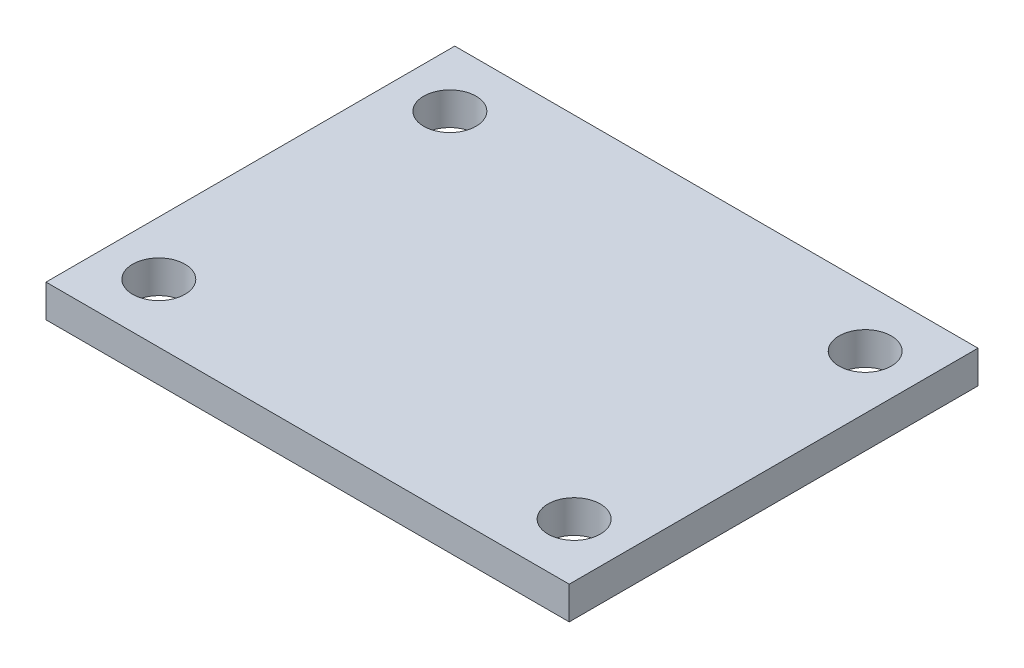
ISO-10303-21;
HEADER;
FILE_DESCRIPTION(('STEP AP214'),'2;1');
FILE_NAME('part.step','',(''),(''),'','','');
FILE_SCHEMA(('AUTOMOTIVE_DESIGN { 1 0 10303 214 1 1 1 1 }'));
ENDSEC;
DATA;
#1=APPLICATION_CONTEXT('core data for automotive mechanical design processes');
#2=APPLICATION_PROTOCOL_DEFINITION('international standard','automotive_design',2000,#1);
#3=PRODUCT_CONTEXT('',#1,'mechanical');
#4=PRODUCT('Part','Part','',(#3));
#5=PRODUCT_RELATED_PRODUCT_CATEGORY('part','',(#4));
#6=PRODUCT_DEFINITION_FORMATION('','',#4);
#7=PRODUCT_DEFINITION_CONTEXT('part definition',#1,'design');
#8=PRODUCT_DEFINITION('design','',#6,#7);
#9=PRODUCT_DEFINITION_SHAPE('','',#8);
#10=(LENGTH_UNIT() NAMED_UNIT(*) SI_UNIT(.MILLI.,.METRE.));
#11=(NAMED_UNIT(*) PLANE_ANGLE_UNIT() SI_UNIT($,.RADIAN.));
#12=(NAMED_UNIT(*) SI_UNIT($,.STERADIAN.) SOLID_ANGLE_UNIT());
#13=UNCERTAINTY_MEASURE_WITH_UNIT(LENGTH_MEASURE(1.E-05),#10,'distance_accuracy_value','');
#14=(GEOMETRIC_REPRESENTATION_CONTEXT(3) GLOBAL_UNCERTAINTY_ASSIGNED_CONTEXT((#13)) GLOBAL_UNIT_ASSIGNED_CONTEXT((#10,
#11,#12)) REPRESENTATION_CONTEXT('',''));
#15=CARTESIAN_POINT('',(0.,0.,0.));
#16=DIRECTION('',(0.,0.,1.));
#17=DIRECTION('',(1.,0.,0.));
#18=AXIS2_PLACEMENT_3D('',#15,#16,#17);
#19=CARTESIAN_POINT('',(-16.,2.,-12.5));
#20=DIRECTION('',(1.,0.,0.));
#21=DIRECTION('',(0.,0.,-1.));
#22=AXIS2_PLACEMENT_3D('',#19,#20,#21);
#23=PLANE('',#22);
#24=DIRECTION('',(0.,0.,1.));
#25=VECTOR('',#24,1.);
#26=CARTESIAN_POINT('',(-16.,0.,-12.5));
#27=LINE('',#26,#25);
#28=CARTESIAN_POINT('',(-16.,0.,-12.5));
#29=VERTEX_POINT('',#28);
#30=CARTESIAN_POINT('',(-16.,0.,12.5));
#31=VERTEX_POINT('',#30);
#32=EDGE_CURVE('E100',#29,#31,#27,.T.);
#33=ORIENTED_EDGE('',*,*,#32,.T.);
#34=DIRECTION('',(0.,-1.,0.));
#35=VECTOR('',#34,1.);
#36=CARTESIAN_POINT('',(-16.,2.,12.5));
#37=LINE('',#36,#35);
#38=CARTESIAN_POINT('',(-16.,2.,12.5));
#39=VERTEX_POINT('',#38);
#40=EDGE_CURVE('E11',#39,#31,#37,.T.);
#41=ORIENTED_EDGE('',*,*,#40,.F.);
#42=DIRECTION('',(0.,0.,1.));
#43=VECTOR('',#42,1.);
#44=CARTESIAN_POINT('',(-16.,2.,-12.5));
#45=LINE('',#44,#43);
#46=CARTESIAN_POINT('',(-16.,2.,-12.5));
#47=VERTEX_POINT('',#46);
#48=EDGE_CURVE('E86',#47,#39,#45,.T.);
#49=ORIENTED_EDGE('',*,*,#48,.F.);
#50=DIRECTION('',(0.,-1.,0.));
#51=VECTOR('',#50,1.);
#52=CARTESIAN_POINT('',(-16.,2.,-12.5));
#53=LINE('',#52,#51);
#54=EDGE_CURVE('E53',#47,#29,#53,.T.);
#55=ORIENTED_EDGE('',*,*,#54,.T.);
#56=EDGE_LOOP('',(#33,#41,#49,#55));
#57=FACE_BOUND('',#56,.T.);
#58=ADVANCED_FACE('F37',(#57),#23,.F.);
#59=CARTESIAN_POINT('',(-16.,2.,12.5));
#60=DIRECTION('',(0.,0.,-1.));
#61=DIRECTION('',(-1.,0.,0.));
#62=AXIS2_PLACEMENT_3D('',#59,#60,#61);
#63=PLANE('',#62);
#64=DIRECTION('',(1.,0.,0.));
#65=VECTOR('',#64,1.);
#66=CARTESIAN_POINT('',(-16.,0.,12.5));
#67=LINE('',#66,#65);
#68=CARTESIAN_POINT('',(16.,0.,12.5));
#69=VERTEX_POINT('',#68);
#70=EDGE_CURVE('E91',#31,#69,#67,.T.);
#71=ORIENTED_EDGE('',*,*,#70,.T.);
#72=DIRECTION('',(0.,-1.,0.));
#73=VECTOR('',#72,1.);
#74=CARTESIAN_POINT('',(16.,2.,12.5));
#75=LINE('',#74,#73);
#76=CARTESIAN_POINT('',(16.,2.,12.5));
#77=VERTEX_POINT('',#76);
#78=EDGE_CURVE('E45',#77,#69,#75,.T.);
#79=ORIENTED_EDGE('',*,*,#78,.F.);
#80=DIRECTION('',(1.,0.,0.));
#81=VECTOR('',#80,1.);
#82=CARTESIAN_POINT('',(-16.,2.,12.5));
#83=LINE('',#82,#81);
#84=EDGE_CURVE('E78',#39,#77,#83,.T.);
#85=ORIENTED_EDGE('',*,*,#84,.F.);
#86=ORIENTED_EDGE('',*,*,#40,.T.);
#87=EDGE_LOOP('',(#71,#79,#85,#86));
#88=FACE_BOUND('',#87,.T.);
#89=ADVANCED_FACE('F90',(#88),#63,.F.);
#90=CARTESIAN_POINT('',(16.,2.,-12.5));
#91=DIRECTION('',(1.,0.,0.));
#92=DIRECTION('',(0.,0.,-1.));
#93=AXIS2_PLACEMENT_3D('',#90,#91,#92);
#94=PLANE('',#93);
#95=DIRECTION('',(0.,0.,1.));
#96=VECTOR('',#95,1.);
#97=CARTESIAN_POINT('',(16.,0.,-12.5));
#98=LINE('',#97,#96);
#99=CARTESIAN_POINT('',(16.,0.,-12.5));
#100=VERTEX_POINT('',#99);
#101=EDGE_CURVE('E104',#100,#69,#98,.T.);
#102=ORIENTED_EDGE('',*,*,#101,.F.);
#103=DIRECTION('',(0.,-1.,0.));
#104=VECTOR('',#103,1.);
#105=CARTESIAN_POINT('',(16.,2.,-12.5));
#106=LINE('',#105,#104);
#107=CARTESIAN_POINT('',(16.,2.,-12.5));
#108=VERTEX_POINT('',#107);
#109=EDGE_CURVE('E67',#108,#100,#106,.T.);
#110=ORIENTED_EDGE('',*,*,#109,.F.);
#111=DIRECTION('',(0.,0.,1.));
#112=VECTOR('',#111,1.);
#113=CARTESIAN_POINT('',(16.,2.,-12.5));
#114=LINE('',#113,#112);
#115=EDGE_CURVE('E85',#108,#77,#114,.T.);
#116=ORIENTED_EDGE('',*,*,#115,.T.);
#117=ORIENTED_EDGE('',*,*,#78,.T.);
#118=EDGE_LOOP('',(#102,#110,#116,#117));
#119=FACE_BOUND('',#118,.T.);
#120=ADVANCED_FACE('F94',(#119),#94,.T.);
#121=CARTESIAN_POINT('',(-16.,2.,-12.5));
#122=DIRECTION('',(0.,0.,-1.));
#123=DIRECTION('',(-1.,0.,0.));
#124=AXIS2_PLACEMENT_3D('',#121,#122,#123);
#125=PLANE('',#124);
#126=DIRECTION('',(1.,0.,0.));
#127=VECTOR('',#126,1.);
#128=CARTESIAN_POINT('',(-16.,0.,-12.5));
#129=LINE('',#128,#127);
#130=EDGE_CURVE('E106',#29,#100,#129,.T.);
#131=ORIENTED_EDGE('',*,*,#130,.F.);
#132=ORIENTED_EDGE('',*,*,#54,.F.);
#133=DIRECTION('',(1.,0.,0.));
#134=VECTOR('',#133,1.);
#135=CARTESIAN_POINT('',(-16.,2.,-12.5));
#136=LINE('',#135,#134);
#137=EDGE_CURVE('E95',#47,#108,#136,.T.);
#138=ORIENTED_EDGE('',*,*,#137,.T.);
#139=ORIENTED_EDGE('',*,*,#109,.T.);
#140=EDGE_LOOP('',(#131,#132,#138,#139));
#141=FACE_BOUND('',#140,.T.);
#142=ADVANCED_FACE('F142',(#141),#125,.T.);
#143=CARTESIAN_POINT('',(0.,2.,0.));
#144=DIRECTION('',(0.,1.,0.));
#145=DIRECTION('',(0.,0.,1.));
#146=AXIS2_PLACEMENT_3D('',#143,#144,#145);
#147=PLANE('',#146);
#148=CARTESIAN_POINT('',(-12.7,2.,8.9));
#149=DIRECTION('',(0.,1.,0.));
#150=DIRECTION('',(0.,0.,1.));
#151=AXIS2_PLACEMENT_3D('',#148,#149,#150);
#152=CIRCLE('',#151,1.6);
#153=CARTESIAN_POINT('',(-12.7,2.,10.5));
#154=VERTEX_POINT('',#153);
#155=EDGE_CURVE('E115',#154,#154,#152,.T.);
#156=ORIENTED_EDGE('',*,*,#155,.F.);
#157=EDGE_LOOP('',(#156));
#158=FACE_BOUND('',#157,.T.);
#159=CARTESIAN_POINT('',(12.7,2.,-8.9));
#160=DIRECTION('',(0.,1.,0.));
#161=DIRECTION('',(0.,0.,1.));
#162=AXIS2_PLACEMENT_3D('',#159,#160,#161);
#163=CIRCLE('',#162,1.6);
#164=CARTESIAN_POINT('',(12.7,2.,-7.29999999999999));
#165=VERTEX_POINT('',#164);
#166=EDGE_CURVE('E121',#165,#165,#163,.T.);
#167=ORIENTED_EDGE('',*,*,#166,.F.);
#168=EDGE_LOOP('',(#167));
#169=FACE_BOUND('',#168,.T.);
#170=CARTESIAN_POINT('',(12.7,2.,8.9));
#171=DIRECTION('',(0.,1.,0.));
#172=DIRECTION('',(0.,0.,1.));
#173=AXIS2_PLACEMENT_3D('',#170,#171,#172);
#174=CIRCLE('',#173,1.6);
#175=CARTESIAN_POINT('',(12.7,2.,10.5));
#176=VERTEX_POINT('',#175);
#177=EDGE_CURVE('E122',#176,#176,#174,.T.);
#178=ORIENTED_EDGE('',*,*,#177,.F.);
#179=EDGE_LOOP('',(#178));
#180=FACE_BOUND('',#179,.T.);
#181=CARTESIAN_POINT('',(-12.7,2.,-8.9));
#182=DIRECTION('',(0.,1.,0.));
#183=DIRECTION('',(0.,0.,1.));
#184=AXIS2_PLACEMENT_3D('',#181,#182,#183);
#185=CIRCLE('',#184,1.6);
#186=CARTESIAN_POINT('',(-12.7,2.,-7.29999999999999));
#187=VERTEX_POINT('',#186);
#188=EDGE_CURVE('E102',#187,#187,#185,.T.);
#189=ORIENTED_EDGE('',*,*,#188,.F.);
#190=EDGE_LOOP('',(#189));
#191=FACE_BOUND('',#190,.T.);
#192=ORIENTED_EDGE('',*,*,#48,.T.);
#193=ORIENTED_EDGE('',*,*,#84,.T.);
#194=ORIENTED_EDGE('',*,*,#115,.F.);
#195=ORIENTED_EDGE('',*,*,#137,.F.);
#196=EDGE_LOOP('',(#192,#193,#194,#195));
#197=FACE_BOUND('',#196,.T.);
#198=ADVANCED_FACE('F82',(#158,#169,#180,#191,#197),#147,.T.);
#199=CARTESIAN_POINT('',(0.,0.,0.));
#200=DIRECTION('',(0.,1.,0.));
#201=DIRECTION('',(0.,0.,1.));
#202=AXIS2_PLACEMENT_3D('',#199,#200,#201);
#203=PLANE('',#202);
#204=CARTESIAN_POINT('',(-12.7,0.,8.9));
#205=DIRECTION('',(0.,1.,0.));
#206=DIRECTION('',(0.,0.,1.));
#207=AXIS2_PLACEMENT_3D('',#204,#205,#206);
#208=CIRCLE('',#207,1.6);
#209=CARTESIAN_POINT('',(-12.7,0.,10.5));
#210=VERTEX_POINT('',#209);
#211=EDGE_CURVE('E125',#210,#210,#208,.T.);
#212=ORIENTED_EDGE('',*,*,#211,.T.);
#213=EDGE_LOOP('',(#212));
#214=FACE_BOUND('',#213,.T.);
#215=CARTESIAN_POINT('',(12.7,0.,-8.9));
#216=DIRECTION('',(0.,1.,0.));
#217=DIRECTION('',(0.,0.,1.));
#218=AXIS2_PLACEMENT_3D('',#215,#216,#217);
#219=CIRCLE('',#218,1.6);
#220=CARTESIAN_POINT('',(12.7,0.,-7.29999999999999));
#221=VERTEX_POINT('',#220);
#222=EDGE_CURVE('E118',#221,#221,#219,.T.);
#223=ORIENTED_EDGE('',*,*,#222,.T.);
#224=EDGE_LOOP('',(#223));
#225=FACE_BOUND('',#224,.T.);
#226=CARTESIAN_POINT('',(12.7,0.,8.9));
#227=DIRECTION('',(0.,1.,0.));
#228=DIRECTION('',(0.,0.,1.));
#229=AXIS2_PLACEMENT_3D('',#226,#227,#228);
#230=CIRCLE('',#229,1.6);
#231=CARTESIAN_POINT('',(12.7,0.,10.5));
#232=VERTEX_POINT('',#231);
#233=EDGE_CURVE('E130',#232,#232,#230,.T.);
#234=ORIENTED_EDGE('',*,*,#233,.T.);
#235=EDGE_LOOP('',(#234));
#236=FACE_BOUND('',#235,.T.);
#237=CARTESIAN_POINT('',(-12.7,0.,-8.9));
#238=DIRECTION('',(0.,1.,0.));
#239=DIRECTION('',(0.,0.,1.));
#240=AXIS2_PLACEMENT_3D('',#237,#238,#239);
#241=CIRCLE('',#240,1.6);
#242=CARTESIAN_POINT('',(-12.7,0.,-7.29999999999999));
#243=VERTEX_POINT('',#242);
#244=EDGE_CURVE('E112',#243,#243,#241,.T.);
#245=ORIENTED_EDGE('',*,*,#244,.T.);
#246=EDGE_LOOP('',(#245));
#247=FACE_BOUND('',#246,.T.);
#248=ORIENTED_EDGE('',*,*,#32,.F.);
#249=ORIENTED_EDGE('',*,*,#130,.T.);
#250=ORIENTED_EDGE('',*,*,#101,.T.);
#251=ORIENTED_EDGE('',*,*,#70,.F.);
#252=EDGE_LOOP('',(#248,#249,#250,#251));
#253=FACE_BOUND('',#252,.T.);
#254=ADVANCED_FACE('F141',(#214,#225,#236,#247,#253),#203,.F.);
#255=CARTESIAN_POINT('',(-12.7,2.,-8.9));
#256=DIRECTION('',(0.,-1.,0.));
#257=DIRECTION('',(0.,0.,-1.));
#258=AXIS2_PLACEMENT_3D('',#255,#256,#257);
#259=CYLINDRICAL_SURFACE('',#258,1.6);
#260=ORIENTED_EDGE('',*,*,#188,.T.);
#261=EDGE_LOOP('',(#260));
#262=FACE_BOUND('',#261,.T.);
#263=ORIENTED_EDGE('',*,*,#244,.F.);
#264=EDGE_LOOP('',(#263));
#265=FACE_BOUND('',#264,.T.);
#266=ADVANCED_FACE('F147',(#262,#265),#259,.F.);
#267=CARTESIAN_POINT('',(12.7,2.,8.9));
#268=DIRECTION('',(0.,-1.,0.));
#269=DIRECTION('',(0.,0.,-1.));
#270=AXIS2_PLACEMENT_3D('',#267,#268,#269);
#271=CYLINDRICAL_SURFACE('',#270,1.6);
#272=ORIENTED_EDGE('',*,*,#177,.T.);
#273=EDGE_LOOP('',(#272));
#274=FACE_BOUND('',#273,.T.);
#275=ORIENTED_EDGE('',*,*,#233,.F.);
#276=EDGE_LOOP('',(#275));
#277=FACE_BOUND('',#276,.T.);
#278=ADVANCED_FACE('F136',(#274,#277),#271,.F.);
#279=CARTESIAN_POINT('',(12.7,2.,-8.9));
#280=DIRECTION('',(0.,-1.,0.));
#281=DIRECTION('',(0.,0.,-1.));
#282=AXIS2_PLACEMENT_3D('',#279,#280,#281);
#283=CYLINDRICAL_SURFACE('',#282,1.6);
#284=ORIENTED_EDGE('',*,*,#166,.T.);
#285=EDGE_LOOP('',(#284));
#286=FACE_BOUND('',#285,.T.);
#287=ORIENTED_EDGE('',*,*,#222,.F.);
#288=EDGE_LOOP('',(#287));
#289=FACE_BOUND('',#288,.T.);
#290=ADVANCED_FACE('F204',(#286,#289),#283,.F.);
#291=CARTESIAN_POINT('',(-12.7,2.,8.9));
#292=DIRECTION('',(0.,-1.,0.));
#293=DIRECTION('',(0.,0.,-1.));
#294=AXIS2_PLACEMENT_3D('',#291,#292,#293);
#295=CYLINDRICAL_SURFACE('',#294,1.6);
#296=ORIENTED_EDGE('',*,*,#155,.T.);
#297=EDGE_LOOP('',(#296));
#298=FACE_BOUND('',#297,.T.);
#299=ORIENTED_EDGE('',*,*,#211,.F.);
#300=EDGE_LOOP('',(#299));
#301=FACE_BOUND('',#300,.T.);
#302=ADVANCED_FACE('F213',(#298,#301),#295,.F.);
#303=CLOSED_SHELL('',(#58,#89,#120,#142,#198,#254,#266,#278,#290,#302));
#304=MANIFOLD_SOLID_BREP('B2',#303);
#305=ADVANCED_BREP_SHAPE_REPRESENTATION('',(#18,#304),#14);
#306=SHAPE_DEFINITION_REPRESENTATION(#9,#305);
ENDSEC;
END-ISO-10303-21;
